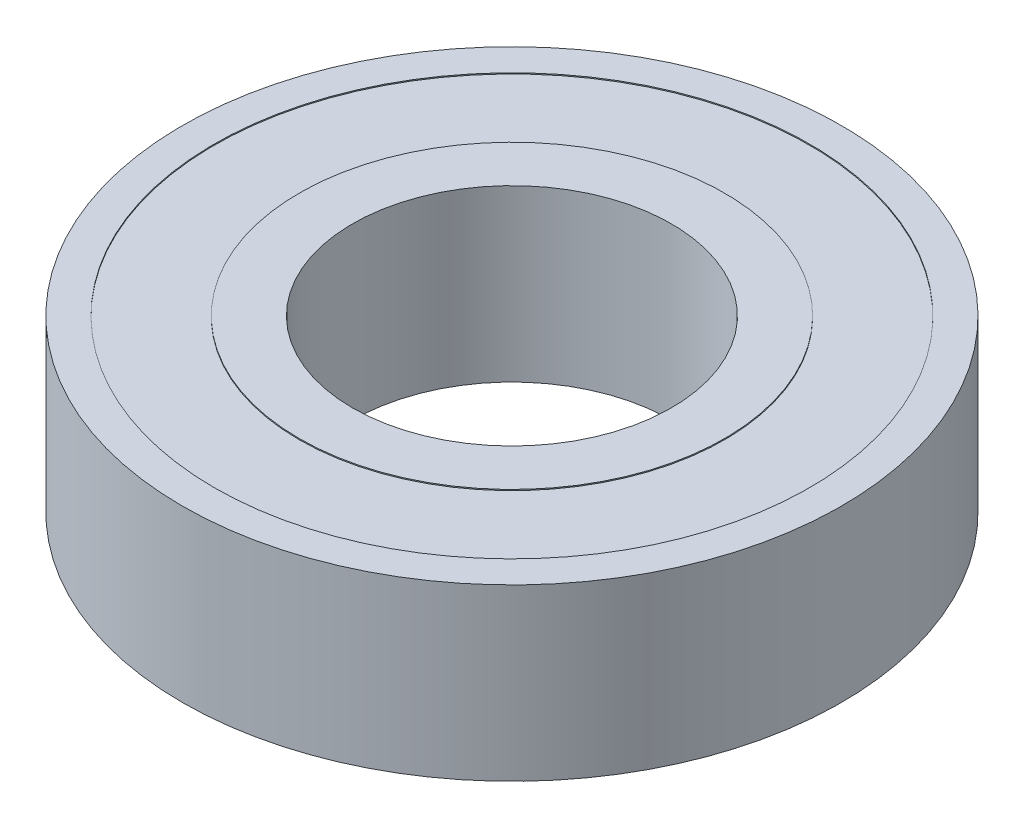
ISO-10303-21;
HEADER;
FILE_DESCRIPTION(('STEP AP214'),'2;1');
FILE_NAME('part.step','',(''),(''),'','','');
FILE_SCHEMA(('AUTOMOTIVE_DESIGN { 1 0 10303 214 1 1 1 1 }'));
ENDSEC;
DATA;
#1=APPLICATION_CONTEXT('core data for automotive mechanical design processes');
#2=APPLICATION_PROTOCOL_DEFINITION('international standard','automotive_design',2000,#1);
#3=PRODUCT_CONTEXT('',#1,'mechanical');
#4=PRODUCT('Part','Part','',(#3));
#5=PRODUCT_RELATED_PRODUCT_CATEGORY('part','',(#4));
#6=PRODUCT_DEFINITION_FORMATION('','',#4);
#7=PRODUCT_DEFINITION_CONTEXT('part definition',#1,'design');
#8=PRODUCT_DEFINITION('design','',#6,#7);
#9=PRODUCT_DEFINITION_SHAPE('','',#8);
#10=(LENGTH_UNIT() NAMED_UNIT(*) SI_UNIT(.MILLI.,.METRE.));
#11=(NAMED_UNIT(*) PLANE_ANGLE_UNIT() SI_UNIT($,.RADIAN.));
#12=(NAMED_UNIT(*) SI_UNIT($,.STERADIAN.) SOLID_ANGLE_UNIT());
#13=UNCERTAINTY_MEASURE_WITH_UNIT(LENGTH_MEASURE(1.E-05),#10,'distance_accuracy_value','');
#14=(GEOMETRIC_REPRESENTATION_CONTEXT(3) GLOBAL_UNCERTAINTY_ASSIGNED_CONTEXT((#13)) GLOBAL_UNIT_ASSIGNED_CONTEXT((#10,
#11,#12)) REPRESENTATION_CONTEXT('',''));
#15=CARTESIAN_POINT('',(0.,0.,0.));
#16=DIRECTION('',(0.,0.,1.));
#17=DIRECTION('',(1.,0.,0.));
#18=AXIS2_PLACEMENT_3D('',#15,#16,#17);
#19=CARTESIAN_POINT('',(0.,-8.,0.));
#20=DIRECTION('',(0.,-1.,0.));
#21=DIRECTION('',(0.,0.,1.));
#22=AXIS2_PLACEMENT_3D('',#19,#20,#21);
#23=PLANE('',#22);
#24=CARTESIAN_POINT('',(0.,-8.,0.));
#25=DIRECTION('',(0.,1.,0.));
#26=DIRECTION('',(0.,0.,1.));
#27=AXIS2_PLACEMENT_3D('',#24,#25,#26);
#28=CIRCLE('',#27,15.);
#29=CARTESIAN_POINT('',(0.,-8.,15.));
#30=VERTEX_POINT('',#29);
#31=EDGE_CURVE('E75',#30,#30,#28,.T.);
#32=ORIENTED_EDGE('',*,*,#31,.T.);
#33=EDGE_LOOP('',(#32));
#34=FACE_BOUND('',#33,.T.);
#35=CARTESIAN_POINT('',(0.,-8.,0.));
#36=DIRECTION('',(0.,1.,0.));
#37=DIRECTION('',(0.,0.,1.));
#38=AXIS2_PLACEMENT_3D('',#35,#36,#37);
#39=CIRCLE('',#38,20.);
#40=CARTESIAN_POINT('',(0.,-8.,20.));
#41=VERTEX_POINT('',#40);
#42=EDGE_CURVE('E88',#41,#41,#39,.T.);
#43=ORIENTED_EDGE('',*,*,#42,.F.);
#44=EDGE_LOOP('',(#43));
#45=FACE_BOUND('',#44,.T.);
#46=ADVANCED_FACE('F39',(#34,#45),#23,.T.);
#47=CARTESIAN_POINT('',(0.,8.,0.));
#48=DIRECTION('',(0.,1.,0.));
#49=DIRECTION('',(0.,0.,1.));
#50=AXIS2_PLACEMENT_3D('',#47,#48,#49);
#51=PLANE('',#50);
#52=CARTESIAN_POINT('',(0.,8.,0.));
#53=DIRECTION('',(0.,1.,0.));
#54=DIRECTION('',(0.,0.,1.));
#55=AXIS2_PLACEMENT_3D('',#52,#53,#54);
#56=CIRCLE('',#55,15.);
#57=CARTESIAN_POINT('',(0.,8.,15.));
#58=VERTEX_POINT('',#57);
#59=EDGE_CURVE('E47',#58,#58,#56,.T.);
#60=ORIENTED_EDGE('',*,*,#59,.F.);
#61=EDGE_LOOP('',(#60));
#62=FACE_BOUND('',#61,.T.);
#63=CARTESIAN_POINT('',(0.,8.,0.));
#64=DIRECTION('',(0.,1.,0.));
#65=DIRECTION('',(0.,0.,1.));
#66=AXIS2_PLACEMENT_3D('',#63,#64,#65);
#67=CIRCLE('',#66,20.);
#68=CARTESIAN_POINT('',(0.,8.,20.));
#69=VERTEX_POINT('',#68);
#70=EDGE_CURVE('E64',#69,#69,#67,.T.);
#71=ORIENTED_EDGE('',*,*,#70,.T.);
#72=EDGE_LOOP('',(#71));
#73=FACE_BOUND('',#72,.T.);
#74=ADVANCED_FACE('F106',(#62,#73),#51,.T.);
#75=CARTESIAN_POINT('',(0.,8.,0.));
#76=DIRECTION('',(0.,1.,0.));
#77=DIRECTION('',(0.,0.,1.));
#78=AXIS2_PLACEMENT_3D('',#75,#76,#77);
#79=CIRCLE('',#78,28.);
#80=CARTESIAN_POINT('',(0.,8.,28.));
#81=VERTEX_POINT('',#80);
#82=EDGE_CURVE('E57',#81,#81,#79,.T.);
#83=ORIENTED_EDGE('',*,*,#82,.F.);
#84=EDGE_LOOP('',(#83));
#85=FACE_BOUND('',#84,.T.);
#86=CARTESIAN_POINT('',(0.,8.,0.));
#87=DIRECTION('',(0.,1.,0.));
#88=DIRECTION('',(0.,0.,1.));
#89=AXIS2_PLACEMENT_3D('',#86,#87,#88);
#90=CIRCLE('',#89,31.);
#91=CARTESIAN_POINT('',(0.,8.,31.));
#92=VERTEX_POINT('',#91);
#93=EDGE_CURVE('E10',#92,#92,#90,.T.);
#94=ORIENTED_EDGE('',*,*,#93,.T.);
#95=EDGE_LOOP('',(#94));
#96=FACE_BOUND('',#95,.T.);
#97=ADVANCED_FACE('F113',(#85,#96),#51,.T.);
#98=CARTESIAN_POINT('',(0.,8.,0.));
#99=DIRECTION('',(0.,-1.,0.));
#100=DIRECTION('',(0.,0.,-1.));
#101=AXIS2_PLACEMENT_3D('',#98,#99,#100);
#102=CYLINDRICAL_SURFACE('',#101,31.);
#103=ORIENTED_EDGE('',*,*,#93,.F.);
#104=EDGE_LOOP('',(#103));
#105=FACE_BOUND('',#104,.T.);
#106=CARTESIAN_POINT('',(0.,-8.,0.));
#107=DIRECTION('',(0.,1.,0.));
#108=DIRECTION('',(0.,0.,1.));
#109=AXIS2_PLACEMENT_3D('',#106,#107,#108);
#110=CIRCLE('',#109,31.);
#111=CARTESIAN_POINT('',(0.,-8.,31.));
#112=VERTEX_POINT('',#111);
#113=EDGE_CURVE('E68',#112,#112,#110,.T.);
#114=ORIENTED_EDGE('',*,*,#113,.T.);
#115=EDGE_LOOP('',(#114));
#116=FACE_BOUND('',#115,.T.);
#117=ADVANCED_FACE('F41',(#105,#116),#102,.T.);
#118=CARTESIAN_POINT('',(0.,8.,0.));
#119=DIRECTION('',(0.,-1.,0.));
#120=DIRECTION('',(0.,0.,-1.));
#121=AXIS2_PLACEMENT_3D('',#118,#119,#120);
#122=CYLINDRICAL_SURFACE('',#121,15.);
#123=ORIENTED_EDGE('',*,*,#59,.T.);
#124=EDGE_LOOP('',(#123));
#125=FACE_BOUND('',#124,.T.);
#126=ORIENTED_EDGE('',*,*,#31,.F.);
#127=EDGE_LOOP('',(#126));
#128=FACE_BOUND('',#127,.T.);
#129=ADVANCED_FACE('F133',(#125,#128),#122,.F.);
#130=CARTESIAN_POINT('',(0.,7.9,0.));
#131=DIRECTION('',(0.,1.,0.));
#132=DIRECTION('',(0.,0.,1.));
#133=AXIS2_PLACEMENT_3D('',#130,#131,#132);
#134=CYLINDRICAL_SURFACE('',#133,28.);
#135=CARTESIAN_POINT('',(0.,7.9,0.));
#136=DIRECTION('',(0.,1.,0.));
#137=DIRECTION('',(0.,0.,1.));
#138=AXIS2_PLACEMENT_3D('',#135,#136,#137);
#139=CIRCLE('',#138,28.);
#140=CARTESIAN_POINT('',(0.,7.9,28.));
#141=VERTEX_POINT('',#140);
#142=EDGE_CURVE('E52',#141,#141,#139,.T.);
#143=ORIENTED_EDGE('',*,*,#142,.F.);
#144=EDGE_LOOP('',(#143));
#145=FACE_BOUND('',#144,.T.);
#146=ORIENTED_EDGE('',*,*,#82,.T.);
#147=EDGE_LOOP('',(#146));
#148=FACE_BOUND('',#147,.T.);
#149=ADVANCED_FACE('F139',(#145,#148),#134,.F.);
#150=CARTESIAN_POINT('',(0.,7.9,0.));
#151=DIRECTION('',(0.,1.,0.));
#152=DIRECTION('',(0.,0.,1.));
#153=AXIS2_PLACEMENT_3D('',#150,#151,#152);
#154=PLANE('',#153);
#155=CARTESIAN_POINT('',(0.,7.9,0.));
#156=DIRECTION('',(0.,1.,0.));
#157=DIRECTION('',(0.,0.,1.));
#158=AXIS2_PLACEMENT_3D('',#155,#156,#157);
#159=CIRCLE('',#158,20.);
#160=CARTESIAN_POINT('',(0.,7.9,20.));
#161=VERTEX_POINT('',#160);
#162=EDGE_CURVE('E62',#161,#161,#159,.T.);
#163=ORIENTED_EDGE('',*,*,#162,.F.);
#164=EDGE_LOOP('',(#163));
#165=FACE_BOUND('',#164,.T.);
#166=ORIENTED_EDGE('',*,*,#142,.T.);
#167=EDGE_LOOP('',(#166));
#168=FACE_BOUND('',#167,.T.);
#169=ADVANCED_FACE('F126',(#165,#168),#154,.T.);
#170=CARTESIAN_POINT('',(0.,7.9,0.));
#171=DIRECTION('',(0.,1.,0.));
#172=DIRECTION('',(0.,0.,1.));
#173=AXIS2_PLACEMENT_3D('',#170,#171,#172);
#174=CYLINDRICAL_SURFACE('',#173,20.);
#175=ORIENTED_EDGE('',*,*,#162,.T.);
#176=EDGE_LOOP('',(#175));
#177=FACE_BOUND('',#176,.T.);
#178=ORIENTED_EDGE('',*,*,#70,.F.);
#179=EDGE_LOOP('',(#178));
#180=FACE_BOUND('',#179,.T.);
#181=ADVANCED_FACE('F118',(#177,#180),#174,.T.);
#182=CARTESIAN_POINT('',(0.,-8.,0.));
#183=DIRECTION('',(0.,1.,0.));
#184=DIRECTION('',(0.,0.,1.));
#185=AXIS2_PLACEMENT_3D('',#182,#183,#184);
#186=CIRCLE('',#185,28.);
#187=CARTESIAN_POINT('',(0.,-8.,28.));
#188=VERTEX_POINT('',#187);
#189=EDGE_CURVE('E80',#188,#188,#186,.T.);
#190=ORIENTED_EDGE('',*,*,#189,.T.);
#191=EDGE_LOOP('',(#190));
#192=FACE_BOUND('',#191,.T.);
#193=ORIENTED_EDGE('',*,*,#113,.F.);
#194=EDGE_LOOP('',(#193));
#195=FACE_BOUND('',#194,.T.);
#196=ADVANCED_FACE('F109',(#192,#195),#23,.T.);
#197=CARTESIAN_POINT('',(0.,-7.9,0.));
#198=DIRECTION('',(0.,-1.,0.));
#199=DIRECTION('',(0.,0.,1.));
#200=AXIS2_PLACEMENT_3D('',#197,#198,#199);
#201=PLANE('',#200);
#202=CARTESIAN_POINT('',(0.,-7.9,0.));
#203=DIRECTION('',(0.,1.,0.));
#204=DIRECTION('',(0.,0.,1.));
#205=AXIS2_PLACEMENT_3D('',#202,#203,#204);
#206=CIRCLE('',#205,28.);
#207=CARTESIAN_POINT('',(0.,-7.9,28.));
#208=VERTEX_POINT('',#207);
#209=EDGE_CURVE('E79',#208,#208,#206,.T.);
#210=ORIENTED_EDGE('',*,*,#209,.F.);
#211=EDGE_LOOP('',(#210));
#212=FACE_BOUND('',#211,.T.);
#213=CARTESIAN_POINT('',(0.,-7.9,0.));
#214=DIRECTION('',(0.,1.,0.));
#215=DIRECTION('',(0.,0.,1.));
#216=AXIS2_PLACEMENT_3D('',#213,#214,#215);
#217=CIRCLE('',#216,20.);
#218=CARTESIAN_POINT('',(0.,-7.9,20.));
#219=VERTEX_POINT('',#218);
#220=EDGE_CURVE('E84',#219,#219,#217,.T.);
#221=ORIENTED_EDGE('',*,*,#220,.T.);
#222=EDGE_LOOP('',(#221));
#223=FACE_BOUND('',#222,.T.);
#224=ADVANCED_FACE('F96',(#212,#223),#201,.T.);
#225=CARTESIAN_POINT('',(0.,-7.9,0.));
#226=DIRECTION('',(0.,-1.,0.));
#227=DIRECTION('',(0.,0.,-1.));
#228=AXIS2_PLACEMENT_3D('',#225,#226,#227);
#229=CYLINDRICAL_SURFACE('',#228,28.);
#230=ORIENTED_EDGE('',*,*,#209,.T.);
#231=EDGE_LOOP('',(#230));
#232=FACE_BOUND('',#231,.T.);
#233=ORIENTED_EDGE('',*,*,#189,.F.);
#234=EDGE_LOOP('',(#233));
#235=FACE_BOUND('',#234,.T.);
#236=ADVANCED_FACE('F101',(#232,#235),#229,.F.);
#237=CARTESIAN_POINT('',(0.,-7.9,0.));
#238=DIRECTION('',(0.,-1.,0.));
#239=DIRECTION('',(0.,0.,-1.));
#240=AXIS2_PLACEMENT_3D('',#237,#238,#239);
#241=CYLINDRICAL_SURFACE('',#240,20.);
#242=ORIENTED_EDGE('',*,*,#220,.F.);
#243=EDGE_LOOP('',(#242));
#244=FACE_BOUND('',#243,.T.);
#245=ORIENTED_EDGE('',*,*,#42,.T.);
#246=EDGE_LOOP('',(#245));
#247=FACE_BOUND('',#246,.T.);
#248=ADVANCED_FACE('F98',(#244,#247),#241,.T.);
#249=CLOSED_SHELL('',(#46,#74,#97,#117,#129,#149,#169,#181,#196,#224,#236,#248));
#250=MANIFOLD_SOLID_BREP('B2',#249);
#251=ADVANCED_BREP_SHAPE_REPRESENTATION('',(#18,#250),#14);
#252=SHAPE_DEFINITION_REPRESENTATION(#9,#251);
ENDSEC;
END-ISO-10303-21;
